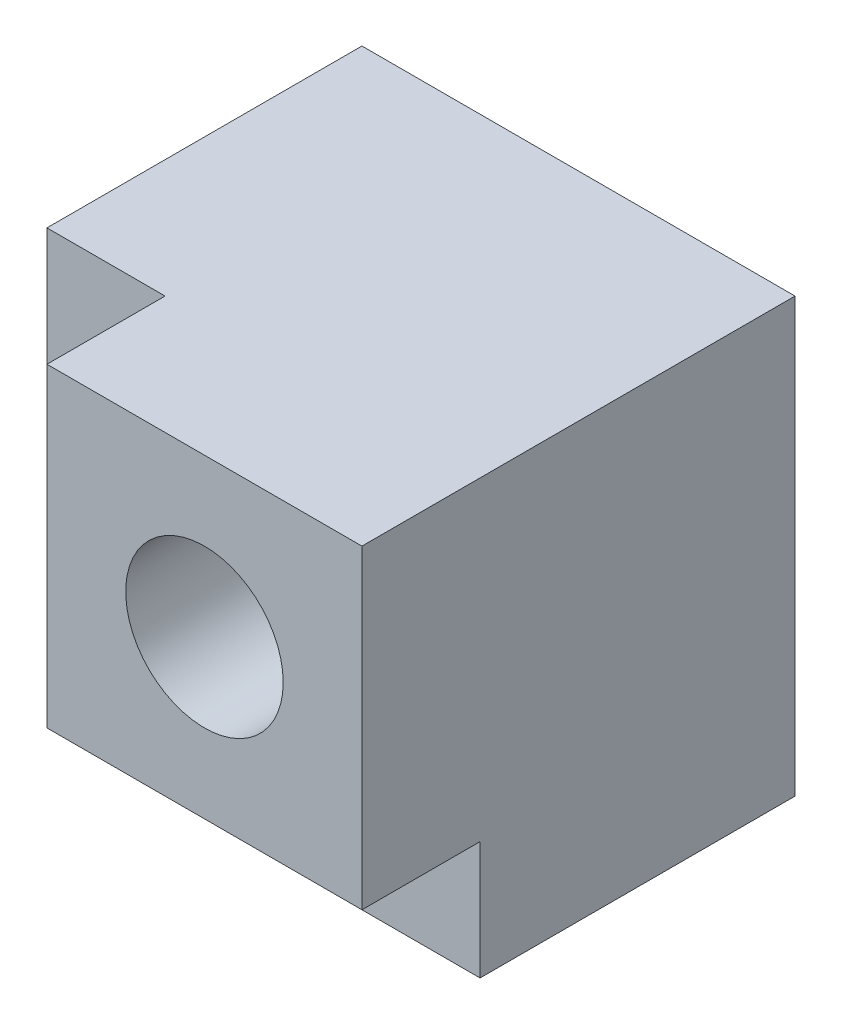
ISO-10303-21;
HEADER;
FILE_DESCRIPTION(('STEP AP214'),'2;1');
FILE_NAME('part.step','',(''),(''),'','','');
FILE_SCHEMA(('AUTOMOTIVE_DESIGN { 1 0 10303 214 1 1 1 1 }'));
ENDSEC;
DATA;
#1=APPLICATION_CONTEXT('core data for automotive mechanical design processes');
#2=APPLICATION_PROTOCOL_DEFINITION('international standard','automotive_design',2000,#1);
#3=PRODUCT_CONTEXT('',#1,'mechanical');
#4=PRODUCT('Part','Part','',(#3));
#5=PRODUCT_RELATED_PRODUCT_CATEGORY('part','',(#4));
#6=PRODUCT_DEFINITION_FORMATION('','',#4);
#7=PRODUCT_DEFINITION_CONTEXT('part definition',#1,'design');
#8=PRODUCT_DEFINITION('design','',#6,#7);
#9=PRODUCT_DEFINITION_SHAPE('','',#8);
#10=(LENGTH_UNIT() NAMED_UNIT(*) SI_UNIT(.MILLI.,.METRE.));
#11=(NAMED_UNIT(*) PLANE_ANGLE_UNIT() SI_UNIT($,.RADIAN.));
#12=(NAMED_UNIT(*) SI_UNIT($,.STERADIAN.) SOLID_ANGLE_UNIT());
#13=UNCERTAINTY_MEASURE_WITH_UNIT(LENGTH_MEASURE(1.E-05),#10,'distance_accuracy_value','');
#14=(GEOMETRIC_REPRESENTATION_CONTEXT(3) GLOBAL_UNCERTAINTY_ASSIGNED_CONTEXT((#13)) GLOBAL_UNIT_ASSIGNED_CONTEXT((#10,
#11,#12)) REPRESENTATION_CONTEXT('',''));
#15=CARTESIAN_POINT('',(0.,0.,0.));
#16=DIRECTION('',(0.,0.,1.));
#17=DIRECTION('',(1.,0.,0.));
#18=AXIS2_PLACEMENT_3D('',#15,#16,#17);
#19=CARTESIAN_POINT('',(0.,0.,0.));
#20=DIRECTION('',(0.,1.,0.));
#21=DIRECTION('',(0.,0.,1.));
#22=AXIS2_PLACEMENT_3D('',#19,#20,#21);
#23=PLANE('',#22);
#24=DIRECTION('',(0.,0.,-1.));
#25=VECTOR('',#24,1.);
#26=CARTESIAN_POINT('',(-40.,0.,40.));
#27=LINE('',#26,#25);
#28=CARTESIAN_POINT('',(-40.,0.,40.));
#29=VERTEX_POINT('',#28);
#30=CARTESIAN_POINT('',(-40.,0.,-40.));
#31=VERTEX_POINT('',#30);
#32=EDGE_CURVE('E120',#29,#31,#27,.T.);
#33=ORIENTED_EDGE('',*,*,#32,.F.);
#34=DIRECTION('',(1.,0.,0.));
#35=VECTOR('',#34,1.);
#36=CARTESIAN_POINT('',(-40.,0.,40.));
#37=LINE('',#36,#35);
#38=CARTESIAN_POINT('',(-70.,0.,40.));
#39=VERTEX_POINT('',#38);
#40=EDGE_CURVE('E163',#39,#29,#37,.T.);
#41=ORIENTED_EDGE('',*,*,#40,.F.);
#42=DIRECTION('',(0.,0.,1.));
#43=VECTOR('',#42,1.);
#44=CARTESIAN_POINT('',(-70.,0.,-40.));
#45=LINE('',#44,#43);
#46=CARTESIAN_POINT('',(-70.,0.,-40.));
#47=VERTEX_POINT('',#46);
#48=EDGE_CURVE('E149',#47,#39,#45,.T.);
#49=ORIENTED_EDGE('',*,*,#48,.F.);
#50=DIRECTION('',(-1.,0.,0.));
#51=VECTOR('',#50,1.);
#52=CARTESIAN_POINT('',(-40.,0.,-40.));
#53=LINE('',#52,#51);
#54=EDGE_CURVE('E47',#31,#47,#53,.T.);
#55=ORIENTED_EDGE('',*,*,#54,.F.);
#56=EDGE_LOOP('',(#33,#41,#49,#55));
#57=FACE_BOUND('',#56,.T.);
#58=ADVANCED_FACE('F32',(#57),#23,.F.);
#59=DIRECTION('',(-1.,0.,0.));
#60=VECTOR('',#59,1.);
#61=CARTESIAN_POINT('',(-40.,0.,40.));
#62=LINE('',#61,#60);
#63=CARTESIAN_POINT('',(40.,0.,40.));
#64=VERTEX_POINT('',#63);
#65=EDGE_CURVE('E55',#64,#29,#62,.T.);
#66=ORIENTED_EDGE('',*,*,#65,.F.);
#67=DIRECTION('',(0.,0.,-1.));
#68=VECTOR('',#67,1.);
#69=CARTESIAN_POINT('',(40.,0.,-40.));
#70=LINE('',#69,#68);
#71=CARTESIAN_POINT('',(40.,0.,70.));
#72=VERTEX_POINT('',#71);
#73=EDGE_CURVE('E158',#72,#64,#70,.T.);
#74=ORIENTED_EDGE('',*,*,#73,.F.);
#75=DIRECTION('',(1.,0.,0.));
#76=VECTOR('',#75,1.);
#77=CARTESIAN_POINT('',(40.,0.,70.));
#78=LINE('',#77,#76);
#79=CARTESIAN_POINT('',(-40.,0.,70.));
#80=VERTEX_POINT('',#79);
#81=EDGE_CURVE('E138',#80,#72,#78,.T.);
#82=ORIENTED_EDGE('',*,*,#81,.F.);
#83=DIRECTION('',(0.,0.,-1.));
#84=VECTOR('',#83,1.);
#85=CARTESIAN_POINT('',(-40.,0.,70.));
#86=LINE('',#85,#84);
#87=EDGE_CURVE('E140',#80,#29,#86,.T.);
#88=ORIENTED_EDGE('',*,*,#87,.T.);
#89=EDGE_LOOP('',(#66,#74,#82,#88));
#90=FACE_BOUND('',#89,.T.);
#91=ADVANCED_FACE('F220',(#90),#23,.F.);
#92=CARTESIAN_POINT('',(-40.,80.,40.));
#93=DIRECTION('',(0.,0.,-1.));
#94=DIRECTION('',(-1.,0.,0.));
#95=AXIS2_PLACEMENT_3D('',#92,#93,#94);
#96=PLANE('',#95);
#97=DIRECTION('',(0.,-1.,0.));
#98=VECTOR('',#97,1.);
#99=CARTESIAN_POINT('',(-40.,80.,40.));
#100=LINE('',#99,#98);
#101=CARTESIAN_POINT('',(-40.,80.,40.));
#102=VERTEX_POINT('',#101);
#103=EDGE_CURVE('E121',#102,#29,#100,.T.);
#104=ORIENTED_EDGE('',*,*,#103,.F.);
#105=DIRECTION('',(1.,0.,0.));
#106=VECTOR('',#105,1.);
#107=CARTESIAN_POINT('',(-40.,80.,40.));
#108=LINE('',#107,#106);
#109=CARTESIAN_POINT('',(-70.,80.,40.));
#110=VERTEX_POINT('',#109);
#111=EDGE_CURVE('E40',#110,#102,#108,.T.);
#112=ORIENTED_EDGE('',*,*,#111,.F.);
#113=DIRECTION('',(0.,1.,0.));
#114=VECTOR('',#113,1.);
#115=CARTESIAN_POINT('',(-70.,80.,40.));
#116=LINE('',#115,#114);
#117=EDGE_CURVE('E152',#39,#110,#116,.T.);
#118=ORIENTED_EDGE('',*,*,#117,.F.);
#119=ORIENTED_EDGE('',*,*,#40,.T.);
#120=EDGE_LOOP('',(#104,#112,#118,#119));
#121=FACE_BOUND('',#120,.T.);
#122=ADVANCED_FACE('F171',(#121),#96,.F.);
#123=CARTESIAN_POINT('',(40.,80.,-40.));
#124=DIRECTION('',(-1.,0.,0.));
#125=DIRECTION('',(0.,0.,1.));
#126=AXIS2_PLACEMENT_3D('',#123,#124,#125);
#127=PLANE('',#126);
#128=ORIENTED_EDGE('',*,*,#73,.T.);
#129=DIRECTION('',(0.,1.,0.));
#130=VECTOR('',#129,1.);
#131=CARTESIAN_POINT('',(40.,-30.,40.));
#132=LINE('',#131,#130);
#133=CARTESIAN_POINT('',(40.,-30.,40.));
#134=VERTEX_POINT('',#133);
#135=EDGE_CURVE('E122',#134,#64,#132,.T.);
#136=ORIENTED_EDGE('',*,*,#135,.F.);
#137=DIRECTION('',(0.,0.,1.));
#138=VECTOR('',#137,1.);
#139=CARTESIAN_POINT('',(40.,-30.,40.));
#140=LINE('',#139,#138);
#141=CARTESIAN_POINT('',(40.,-30.,-40.));
#142=VERTEX_POINT('',#141);
#143=EDGE_CURVE('E108',#142,#134,#140,.T.);
#144=ORIENTED_EDGE('',*,*,#143,.F.);
#145=DIRECTION('',(0.,-1.,0.));
#146=VECTOR('',#145,1.);
#147=CARTESIAN_POINT('',(40.,80.,-40.));
#148=LINE('',#147,#146);
#149=CARTESIAN_POINT('',(40.,80.,-40.));
#150=VERTEX_POINT('',#149);
#151=EDGE_CURVE('E11',#150,#142,#148,.T.);
#152=ORIENTED_EDGE('',*,*,#151,.F.);
#153=DIRECTION('',(0.,0.,-1.));
#154=VECTOR('',#153,1.);
#155=CARTESIAN_POINT('',(40.,80.,-40.));
#156=LINE('',#155,#154);
#157=CARTESIAN_POINT('',(40.,80.,70.));
#158=VERTEX_POINT('',#157);
#159=EDGE_CURVE('E159',#158,#150,#156,.T.);
#160=ORIENTED_EDGE('',*,*,#159,.F.);
#161=DIRECTION('',(0.,1.,0.));
#162=VECTOR('',#161,1.);
#163=CARTESIAN_POINT('',(40.,80.,70.));
#164=LINE('',#163,#162);
#165=EDGE_CURVE('E125',#72,#158,#164,.T.);
#166=ORIENTED_EDGE('',*,*,#165,.F.);
#167=EDGE_LOOP('',(#128,#136,#144,#152,#160,#166));
#168=FACE_BOUND('',#167,.T.);
#169=ADVANCED_FACE('F34',(#168),#127,.F.);
#170=CARTESIAN_POINT('',(-40.,80.,-40.));
#171=DIRECTION('',(0.,0.,1.));
#172=DIRECTION('',(1.,0.,0.));
#173=AXIS2_PLACEMENT_3D('',#170,#171,#172);
#174=PLANE('',#173);
#175=ORIENTED_EDGE('',*,*,#151,.T.);
#176=DIRECTION('',(1.,0.,0.));
#177=VECTOR('',#176,1.);
#178=CARTESIAN_POINT('',(-40.,-30.,-40.));
#179=LINE('',#178,#177);
#180=CARTESIAN_POINT('',(-40.,-30.,-40.));
#181=VERTEX_POINT('',#180);
#182=EDGE_CURVE('E99',#181,#142,#179,.T.);
#183=ORIENTED_EDGE('',*,*,#182,.F.);
#184=DIRECTION('',(0.,1.,0.));
#185=VECTOR('',#184,1.);
#186=CARTESIAN_POINT('',(-40.,-30.,-40.));
#187=LINE('',#186,#185);
#188=EDGE_CURVE('E103',#181,#31,#187,.T.);
#189=ORIENTED_EDGE('',*,*,#188,.T.);
#190=ORIENTED_EDGE('',*,*,#54,.T.);
#191=DIRECTION('',(0.,-1.,0.));
#192=VECTOR('',#191,1.);
#193=CARTESIAN_POINT('',(-70.,80.,-40.));
#194=LINE('',#193,#192);
#195=CARTESIAN_POINT('',(-70.,80.,-40.));
#196=VERTEX_POINT('',#195);
#197=EDGE_CURVE('E146',#196,#47,#194,.T.);
#198=ORIENTED_EDGE('',*,*,#197,.F.);
#199=DIRECTION('',(-1.,0.,0.));
#200=VECTOR('',#199,1.);
#201=CARTESIAN_POINT('',(-40.,80.,-40.));
#202=LINE('',#201,#200);
#203=EDGE_CURVE('E162',#150,#196,#202,.T.);
#204=ORIENTED_EDGE('',*,*,#203,.F.);
#205=EDGE_LOOP('',(#175,#183,#189,#190,#198,#204));
#206=FACE_BOUND('',#205,.T.);
#207=ADVANCED_FACE('F101',(#206),#174,.F.);
#208=CARTESIAN_POINT('',(0.,80.,0.));
#209=DIRECTION('',(0.,1.,0.));
#210=DIRECTION('',(0.,0.,1.));
#211=AXIS2_PLACEMENT_3D('',#208,#209,#210);
#212=PLANE('',#211);
#213=ORIENTED_EDGE('',*,*,#159,.T.);
#214=ORIENTED_EDGE('',*,*,#203,.T.);
#215=DIRECTION('',(0.,0.,-1.));
#216=VECTOR('',#215,1.);
#217=CARTESIAN_POINT('',(-70.,80.,-40.));
#218=LINE('',#217,#216);
#219=EDGE_CURVE('E155',#110,#196,#218,.T.);
#220=ORIENTED_EDGE('',*,*,#219,.F.);
#221=ORIENTED_EDGE('',*,*,#111,.T.);
#222=DIRECTION('',(0.,0.,-1.));
#223=VECTOR('',#222,1.);
#224=CARTESIAN_POINT('',(-40.,80.,70.));
#225=LINE('',#224,#223);
#226=CARTESIAN_POINT('',(-40.,80.,70.));
#227=VERTEX_POINT('',#226);
#228=EDGE_CURVE('E143',#227,#102,#225,.T.);
#229=ORIENTED_EDGE('',*,*,#228,.F.);
#230=DIRECTION('',(-1.,0.,0.));
#231=VECTOR('',#230,1.);
#232=CARTESIAN_POINT('',(40.,80.,70.));
#233=LINE('',#232,#231);
#234=EDGE_CURVE('E134',#158,#227,#233,.T.);
#235=ORIENTED_EDGE('',*,*,#234,.F.);
#236=EDGE_LOOP('',(#213,#214,#220,#221,#229,#235));
#237=FACE_BOUND('',#236,.T.);
#238=ADVANCED_FACE('F227',(#237),#212,.T.);
#239=CARTESIAN_POINT('',(-70.,0.,0.));
#240=DIRECTION('',(-1.,0.,0.));
#241=DIRECTION('',(0.,0.,1.));
#242=AXIS2_PLACEMENT_3D('',#239,#240,#241);
#243=PLANE('',#242);
#244=CARTESIAN_POINT('',(-70.,40.,0.));
#245=DIRECTION('',(-1.,0.,0.));
#246=DIRECTION('',(0.,0.,1.));
#247=AXIS2_PLACEMENT_3D('',#244,#245,#246);
#248=CIRCLE('',#247,20.);
#249=CARTESIAN_POINT('',(-70.,40.,20.));
#250=VERTEX_POINT('',#249);
#251=EDGE_CURVE('E181',#250,#250,#248,.T.);
#252=ORIENTED_EDGE('',*,*,#251,.F.);
#253=EDGE_LOOP('',(#252));
#254=FACE_BOUND('',#253,.T.);
#255=ORIENTED_EDGE('',*,*,#197,.T.);
#256=ORIENTED_EDGE('',*,*,#48,.T.);
#257=ORIENTED_EDGE('',*,*,#117,.T.);
#258=ORIENTED_EDGE('',*,*,#219,.T.);
#259=EDGE_LOOP('',(#255,#256,#257,#258));
#260=FACE_BOUND('',#259,.T.);
#261=ADVANCED_FACE('F235',(#254,#260),#243,.T.);
#262=CARTESIAN_POINT('',(-40.,80.,70.));
#263=DIRECTION('',(1.,0.,0.));
#264=DIRECTION('',(0.,0.,-1.));
#265=AXIS2_PLACEMENT_3D('',#262,#263,#264);
#266=PLANE('',#265);
#267=ORIENTED_EDGE('',*,*,#103,.T.);
#268=ORIENTED_EDGE('',*,*,#87,.F.);
#269=DIRECTION('',(0.,-1.,0.));
#270=VECTOR('',#269,1.);
#271=CARTESIAN_POINT('',(-40.,80.,70.));
#272=LINE('',#271,#270);
#273=EDGE_CURVE('E136',#227,#80,#272,.T.);
#274=ORIENTED_EDGE('',*,*,#273,.F.);
#275=ORIENTED_EDGE('',*,*,#228,.T.);
#276=EDGE_LOOP('',(#267,#268,#274,#275));
#277=FACE_BOUND('',#276,.T.);
#278=ADVANCED_FACE('F249',(#277),#266,.F.);
#279=CARTESIAN_POINT('',(0.,0.,70.));
#280=DIRECTION('',(0.,0.,-1.));
#281=DIRECTION('',(-1.,0.,0.));
#282=AXIS2_PLACEMENT_3D('',#279,#280,#281);
#283=PLANE('',#282);
#284=CARTESIAN_POINT('',(0.,40.,70.));
#285=DIRECTION('',(0.,0.,1.));
#286=DIRECTION('',(1.,0.,0.));
#287=AXIS2_PLACEMENT_3D('',#284,#285,#286);
#288=CIRCLE('',#287,20.);
#289=CARTESIAN_POINT('',(20.,40.,70.));
#290=VERTEX_POINT('',#289);
#291=EDGE_CURVE('E187',#290,#290,#288,.T.);
#292=ORIENTED_EDGE('',*,*,#291,.F.);
#293=EDGE_LOOP('',(#292));
#294=FACE_BOUND('',#293,.T.);
#295=ORIENTED_EDGE('',*,*,#165,.T.);
#296=ORIENTED_EDGE('',*,*,#234,.T.);
#297=ORIENTED_EDGE('',*,*,#273,.T.);
#298=ORIENTED_EDGE('',*,*,#81,.T.);
#299=EDGE_LOOP('',(#295,#296,#297,#298));
#300=FACE_BOUND('',#299,.T.);
#301=ADVANCED_FACE('F243',(#294,#300),#283,.F.);
#302=CARTESIAN_POINT('',(-40.,-30.,40.));
#303=DIRECTION('',(1.,0.,0.));
#304=DIRECTION('',(0.,0.,-1.));
#305=AXIS2_PLACEMENT_3D('',#302,#303,#304);
#306=PLANE('',#305);
#307=ORIENTED_EDGE('',*,*,#32,.T.);
#308=ORIENTED_EDGE('',*,*,#188,.F.);
#309=DIRECTION('',(0.,0.,-1.));
#310=VECTOR('',#309,1.);
#311=CARTESIAN_POINT('',(-40.,-30.,40.));
#312=LINE('',#311,#310);
#313=CARTESIAN_POINT('',(-40.,-30.,40.));
#314=VERTEX_POINT('',#313);
#315=EDGE_CURVE('E109',#314,#181,#312,.T.);
#316=ORIENTED_EDGE('',*,*,#315,.F.);
#317=DIRECTION('',(0.,1.,0.));
#318=VECTOR('',#317,1.);
#319=CARTESIAN_POINT('',(-40.,-30.,40.));
#320=LINE('',#319,#318);
#321=EDGE_CURVE('E128',#314,#29,#320,.T.);
#322=ORIENTED_EDGE('',*,*,#321,.T.);
#323=EDGE_LOOP('',(#307,#308,#316,#322));
#324=FACE_BOUND('',#323,.T.);
#325=ADVANCED_FACE('F119',(#324),#306,.F.);
#326=CARTESIAN_POINT('',(-40.,-30.,40.));
#327=DIRECTION('',(0.,0.,-1.));
#328=DIRECTION('',(-1.,0.,0.));
#329=AXIS2_PLACEMENT_3D('',#326,#327,#328);
#330=PLANE('',#329);
#331=ORIENTED_EDGE('',*,*,#65,.T.);
#332=ORIENTED_EDGE('',*,*,#321,.F.);
#333=DIRECTION('',(-1.,0.,0.));
#334=VECTOR('',#333,1.);
#335=CARTESIAN_POINT('',(-40.,-30.,40.));
#336=LINE('',#335,#334);
#337=EDGE_CURVE('E114',#134,#314,#336,.T.);
#338=ORIENTED_EDGE('',*,*,#337,.F.);
#339=ORIENTED_EDGE('',*,*,#135,.T.);
#340=EDGE_LOOP('',(#331,#332,#338,#339));
#341=FACE_BOUND('',#340,.T.);
#342=ADVANCED_FACE('F175',(#341),#330,.F.);
#343=CARTESIAN_POINT('',(0.,-30.,0.));
#344=DIRECTION('',(0.,-1.,0.));
#345=DIRECTION('',(0.,0.,-1.));
#346=AXIS2_PLACEMENT_3D('',#343,#344,#345);
#347=PLANE('',#346);
#348=CARTESIAN_POINT('',(0.,-30.,0.));
#349=DIRECTION('',(0.,-1.,0.));
#350=DIRECTION('',(0.,0.,-1.));
#351=AXIS2_PLACEMENT_3D('',#348,#349,#350);
#352=CIRCLE('',#351,20.);
#353=CARTESIAN_POINT('',(0.,-30.,-20.));
#354=VERTEX_POINT('',#353);
#355=EDGE_CURVE('E193',#354,#354,#352,.T.);
#356=ORIENTED_EDGE('',*,*,#355,.F.);
#357=EDGE_LOOP('',(#356));
#358=FACE_BOUND('',#357,.T.);
#359=ORIENTED_EDGE('',*,*,#315,.T.);
#360=ORIENTED_EDGE('',*,*,#182,.T.);
#361=ORIENTED_EDGE('',*,*,#143,.T.);
#362=ORIENTED_EDGE('',*,*,#337,.T.);
#363=EDGE_LOOP('',(#359,#360,#361,#362));
#364=FACE_BOUND('',#363,.T.);
#365=ADVANCED_FACE('F112',(#358,#364),#347,.T.);
#366=CARTESIAN_POINT('',(-25.,40.,0.));
#367=DIRECTION('',(-1.,0.,0.));
#368=DIRECTION('',(0.,0.,1.));
#369=AXIS2_PLACEMENT_3D('',#366,#367,#368);
#370=CYLINDRICAL_SURFACE('',#369,20.);
#371=CARTESIAN_POINT('',(-25.,40.,0.));
#372=DIRECTION('',(-1.,0.,0.));
#373=DIRECTION('',(0.,0.,1.));
#374=AXIS2_PLACEMENT_3D('',#371,#372,#373);
#375=CIRCLE('',#374,20.);
#376=CARTESIAN_POINT('',(-25.,40.,20.));
#377=VERTEX_POINT('',#376);
#378=EDGE_CURVE('E172',#377,#377,#375,.T.);
#379=CARTESIAN_POINT('',(-25.,40.,20.));
#380=CARTESIAN_POINT('',(-25.46875,40.,20.));
#381=CARTESIAN_POINT('',(-25.9375,40.,20.));
#382=CARTESIAN_POINT('',(-26.875,40.,20.));
#383=CARTESIAN_POINT('',(-27.34375,40.,20.));
#384=CARTESIAN_POINT('',(-28.28125,40.,20.));
#385=CARTESIAN_POINT('',(-28.75,40.,20.));
#386=CARTESIAN_POINT('',(-29.6875,40.,20.));
#387=CARTESIAN_POINT('',(-30.15625,40.,20.));
#388=CARTESIAN_POINT('',(-31.09375,40.,20.));
#389=CARTESIAN_POINT('',(-31.5625,40.,20.));
#390=CARTESIAN_POINT('',(-32.5,40.,20.));
#391=CARTESIAN_POINT('',(-32.96875,40.,20.));
#392=CARTESIAN_POINT('',(-33.90625,40.,20.));
#393=CARTESIAN_POINT('',(-34.375,40.,20.));
#394=CARTESIAN_POINT('',(-35.3125,40.,20.));
#395=CARTESIAN_POINT('',(-35.78125,40.,20.));
#396=CARTESIAN_POINT('',(-36.71875,40.,20.));
#397=CARTESIAN_POINT('',(-37.1875,40.,20.));
#398=CARTESIAN_POINT('',(-38.125,40.,20.));
#399=CARTESIAN_POINT('',(-38.59375,40.,20.));
#400=CARTESIAN_POINT('',(-39.53125,40.,20.));
#401=CARTESIAN_POINT('',(-40.,40.,20.));
#402=CARTESIAN_POINT('',(-40.9375,40.,20.));
#403=CARTESIAN_POINT('',(-41.40625,40.,20.));
#404=CARTESIAN_POINT('',(-42.34375,40.,20.));
#405=CARTESIAN_POINT('',(-42.8125,40.,20.));
#406=CARTESIAN_POINT('',(-43.75,40.,20.));
#407=CARTESIAN_POINT('',(-44.21875,40.,20.));
#408=CARTESIAN_POINT('',(-45.15625,40.,20.));
#409=CARTESIAN_POINT('',(-45.625,40.,20.));
#410=CARTESIAN_POINT('',(-46.5625,40.,20.));
#411=CARTESIAN_POINT('',(-47.03125,40.,20.));
#412=CARTESIAN_POINT('',(-47.96875,40.,20.));
#413=CARTESIAN_POINT('',(-48.4375,40.,20.));
#414=CARTESIAN_POINT('',(-49.375,40.,20.));
#415=CARTESIAN_POINT('',(-49.84375,40.,20.));
#416=CARTESIAN_POINT('',(-50.78125,40.,20.));
#417=CARTESIAN_POINT('',(-51.25,40.,20.));
#418=CARTESIAN_POINT('',(-52.1875,40.,20.));
#419=CARTESIAN_POINT('',(-52.65625,40.,20.));
#420=CARTESIAN_POINT('',(-53.59375,40.,20.));
#421=CARTESIAN_POINT('',(-54.0625,40.,20.));
#422=CARTESIAN_POINT('',(-55.,40.,20.));
#423=CARTESIAN_POINT('',(-55.46875,40.,20.));
#424=CARTESIAN_POINT('',(-56.40625,40.,20.));
#425=CARTESIAN_POINT('',(-56.875,40.,20.));
#426=CARTESIAN_POINT('',(-57.8125,40.,20.));
#427=CARTESIAN_POINT('',(-58.28125,40.,20.));
#428=CARTESIAN_POINT('',(-59.21875,40.,20.));
#429=CARTESIAN_POINT('',(-59.6875,40.,20.));
#430=CARTESIAN_POINT('',(-60.625,40.,20.));
#431=CARTESIAN_POINT('',(-61.09375,40.,20.));
#432=CARTESIAN_POINT('',(-62.03125,40.,20.));
#433=CARTESIAN_POINT('',(-62.5,40.,20.));
#434=CARTESIAN_POINT('',(-63.4375,40.,20.));
#435=CARTESIAN_POINT('',(-63.90625,40.,20.));
#436=CARTESIAN_POINT('',(-64.84375,40.,20.));
#437=CARTESIAN_POINT('',(-65.3125,40.,20.));
#438=CARTESIAN_POINT('',(-66.25,40.,20.));
#439=CARTESIAN_POINT('',(-66.71875,40.,20.));
#440=CARTESIAN_POINT('',(-67.65625,40.,20.));
#441=CARTESIAN_POINT('',(-68.125,40.,20.));
#442=CARTESIAN_POINT('',(-69.0625,40.,20.));
#443=CARTESIAN_POINT('',(-69.53125,40.,20.));
#444=CARTESIAN_POINT('',(-70.,40.,20.));
#445=B_SPLINE_CURVE_WITH_KNOTS('',3,(#379,#380,#381,#382,#383,#384,#385,#386,#387,#388,#389,
#390,#391,#392,#393,#394,#395,#396,#397,#398,#399,#400,#401,#402,#403,#404,#405,#406,#407,#408,
#409,#410,#411,#412,#413,#414,#415,#416,#417,#418,#419,#420,#421,#422,#423,#424,#425,#426,#427,
#428,#429,#430,#431,#432,#433,#434,#435,#436,#437,#438,#439,#440,#441,#442,#443,#444),
.UNSPECIFIED.,.F.,.F.,(4,2,2,2,2,2,2,2,2,2,2,2,2,2,2,2,2,2,2,2,2,2,2,2,2,2,2,2,2,2,2,2,4),(0.,
1.40625,2.8125,4.21875,5.625,7.03125,8.4375,9.84375,11.25,12.65625,14.0625,15.46875,16.875,
18.28125,19.6875,21.09375,22.5,23.90625,25.3125,26.71875,28.125,29.53125,30.9375,32.34375,33.75,
35.15625,36.5625,37.96875,39.375,40.78125,42.1875,43.59375,45.),.UNSPECIFIED.);
#446=EDGE_CURVE('BSEAM209',#377,#250,#445,.T.);
#447=ORIENTED_EDGE('',*,*,#378,.F.);
#448=ORIENTED_EDGE('',*,*,#251,.T.);
#449=ORIENTED_EDGE('',*,*,#446,.T.);
#450=ORIENTED_EDGE('',*,*,#446,.F.);
#451=EDGE_LOOP('',(#447,#449,#448,#450));
#452=FACE_BOUND('',#451,.T.);
#453=ADVANCED_FACE('F209',(#452),#370,.F.);
#454=CARTESIAN_POINT('',(-25.,40.,0.));
#455=DIRECTION('',(-1.,0.,0.));
#456=DIRECTION('',(0.,0.,1.));
#457=AXIS2_PLACEMENT_3D('',#454,#455,#456);
#458=PLANE('',#457);
#459=ORIENTED_EDGE('',*,*,#378,.T.);
#460=EDGE_LOOP('',(#459));
#461=FACE_BOUND('',#460,.T.);
#462=ADVANCED_FACE('F215',(#461),#458,.T.);
#463=CARTESIAN_POINT('',(0.,40.,25.));
#464=DIRECTION('',(0.,0.,1.));
#465=DIRECTION('',(1.,0.,0.));
#466=AXIS2_PLACEMENT_3D('',#463,#464,#465);
#467=CYLINDRICAL_SURFACE('',#466,20.);
#468=CARTESIAN_POINT('',(0.,40.,25.));
#469=DIRECTION('',(0.,0.,1.));
#470=DIRECTION('',(1.,0.,0.));
#471=AXIS2_PLACEMENT_3D('',#468,#469,#470);
#472=CIRCLE('',#471,20.);
#473=CARTESIAN_POINT('',(20.,40.,25.));
#474=VERTEX_POINT('',#473);
#475=EDGE_CURVE('E184',#474,#474,#472,.T.);
#476=CARTESIAN_POINT('',(20.,40.,25.));
#477=CARTESIAN_POINT('',(20.,40.,25.46875));
#478=CARTESIAN_POINT('',(20.,40.,25.9375));
#479=CARTESIAN_POINT('',(20.,40.,26.875));
#480=CARTESIAN_POINT('',(20.,40.,27.34375));
#481=CARTESIAN_POINT('',(20.,40.,28.28125));
#482=CARTESIAN_POINT('',(20.,40.,28.75));
#483=CARTESIAN_POINT('',(20.,40.,29.6875));
#484=CARTESIAN_POINT('',(20.,40.,30.15625));
#485=CARTESIAN_POINT('',(20.,40.,31.09375));
#486=CARTESIAN_POINT('',(20.,40.,31.5625));
#487=CARTESIAN_POINT('',(20.,40.,32.5));
#488=CARTESIAN_POINT('',(20.,40.,32.96875));
#489=CARTESIAN_POINT('',(20.,40.,33.90625));
#490=CARTESIAN_POINT('',(20.,40.,34.375));
#491=CARTESIAN_POINT('',(20.,40.,35.3125));
#492=CARTESIAN_POINT('',(20.,40.,35.78125));
#493=CARTESIAN_POINT('',(20.,40.,36.71875));
#494=CARTESIAN_POINT('',(20.,40.,37.1875));
#495=CARTESIAN_POINT('',(20.,40.,38.125));
#496=CARTESIAN_POINT('',(20.,40.,38.59375));
#497=CARTESIAN_POINT('',(20.,40.,39.53125));
#498=CARTESIAN_POINT('',(20.,40.,40.));
#499=CARTESIAN_POINT('',(20.,40.,40.9375));
#500=CARTESIAN_POINT('',(20.,40.,41.40625));
#501=CARTESIAN_POINT('',(20.,40.,42.34375));
#502=CARTESIAN_POINT('',(20.,40.,42.8125));
#503=CARTESIAN_POINT('',(20.,40.,43.75));
#504=CARTESIAN_POINT('',(20.,40.,44.21875));
#505=CARTESIAN_POINT('',(20.,40.,45.15625));
#506=CARTESIAN_POINT('',(20.,40.,45.625));
#507=CARTESIAN_POINT('',(20.,40.,46.5625));
#508=CARTESIAN_POINT('',(20.,40.,47.03125));
#509=CARTESIAN_POINT('',(20.,40.,47.96875));
#510=CARTESIAN_POINT('',(20.,40.,48.4375));
#511=CARTESIAN_POINT('',(20.,40.,49.375));
#512=CARTESIAN_POINT('',(20.,40.,49.84375));
#513=CARTESIAN_POINT('',(20.,40.,50.78125));
#514=CARTESIAN_POINT('',(20.,40.,51.25));
#515=CARTESIAN_POINT('',(20.,40.,52.1875));
#516=CARTESIAN_POINT('',(20.,40.,52.65625));
#517=CARTESIAN_POINT('',(20.,40.,53.59375));
#518=CARTESIAN_POINT('',(20.,40.,54.0625));
#519=CARTESIAN_POINT('',(20.,40.,55.));
#520=CARTESIAN_POINT('',(20.,40.,55.46875));
#521=CARTESIAN_POINT('',(20.,40.,56.40625));
#522=CARTESIAN_POINT('',(20.,40.,56.875));
#523=CARTESIAN_POINT('',(20.,40.,57.8125));
#524=CARTESIAN_POINT('',(20.,40.,58.28125));
#525=CARTESIAN_POINT('',(20.,40.,59.21875));
#526=CARTESIAN_POINT('',(20.,40.,59.6875));
#527=CARTESIAN_POINT('',(20.,40.,60.625));
#528=CARTESIAN_POINT('',(20.,40.,61.09375));
#529=CARTESIAN_POINT('',(20.,40.,62.03125));
#530=CARTESIAN_POINT('',(20.,40.,62.5));
#531=CARTESIAN_POINT('',(20.,40.,63.4375));
#532=CARTESIAN_POINT('',(20.,40.,63.90625));
#533=CARTESIAN_POINT('',(20.,40.,64.84375));
#534=CARTESIAN_POINT('',(20.,40.,65.3125));
#535=CARTESIAN_POINT('',(20.,40.,66.25));
#536=CARTESIAN_POINT('',(20.,40.,66.71875));
#537=CARTESIAN_POINT('',(20.,40.,67.65625));
#538=CARTESIAN_POINT('',(20.,40.,68.125));
#539=CARTESIAN_POINT('',(20.,40.,69.0625));
#540=CARTESIAN_POINT('',(20.,40.,69.53125));
#541=CARTESIAN_POINT('',(20.,40.,70.));
#542=B_SPLINE_CURVE_WITH_KNOTS('',3,(#476,#477,#478,#479,#480,#481,#482,#483,#484,#485,#486,
#487,#488,#489,#490,#491,#492,#493,#494,#495,#496,#497,#498,#499,#500,#501,#502,#503,#504,#505,
#506,#507,#508,#509,#510,#511,#512,#513,#514,#515,#516,#517,#518,#519,#520,#521,#522,#523,#524,
#525,#526,#527,#528,#529,#530,#531,#532,#533,#534,#535,#536,#537,#538,#539,#540,#541),
.UNSPECIFIED.,.F.,.F.,(4,2,2,2,2,2,2,2,2,2,2,2,2,2,2,2,2,2,2,2,2,2,2,2,2,2,2,2,2,2,2,2,4),(0.,
1.40625,2.8125,4.21875,5.625,7.03125,8.4375,9.84375,11.25,12.65625,14.0625,15.46875,16.875,
18.28125,19.6875,21.09375,22.5,23.90625,25.3125,26.71875,28.125,29.53125,30.9375,32.34375,33.75,
35.15625,36.5625,37.96875,39.375,40.78125,42.1875,43.59375,45.),.UNSPECIFIED.);
#543=EDGE_CURVE('BSEAM294',#474,#290,#542,.T.);
#544=ORIENTED_EDGE('',*,*,#475,.F.);
#545=ORIENTED_EDGE('',*,*,#291,.T.);
#546=ORIENTED_EDGE('',*,*,#543,.T.);
#547=ORIENTED_EDGE('',*,*,#543,.F.);
#548=EDGE_LOOP('',(#544,#546,#545,#547));
#549=FACE_BOUND('',#548,.T.);
#550=ADVANCED_FACE('F294',(#549),#467,.F.);
#551=CARTESIAN_POINT('',(0.,40.,25.));
#552=DIRECTION('',(0.,0.,1.));
#553=DIRECTION('',(1.,0.,0.));
#554=AXIS2_PLACEMENT_3D('',#551,#552,#553);
#555=PLANE('',#554);
#556=ORIENTED_EDGE('',*,*,#475,.T.);
#557=EDGE_LOOP('',(#556));
#558=FACE_BOUND('',#557,.T.);
#559=ADVANCED_FACE('F204',(#558),#555,.T.);
#560=CARTESIAN_POINT('',(0.,15.,0.));
#561=DIRECTION('',(0.,-1.,0.));
#562=DIRECTION('',(0.,0.,-1.));
#563=AXIS2_PLACEMENT_3D('',#560,#561,#562);
#564=CYLINDRICAL_SURFACE('',#563,20.);
#565=CARTESIAN_POINT('',(0.,15.,0.));
#566=DIRECTION('',(0.,-1.,0.));
#567=DIRECTION('',(0.,0.,-1.));
#568=AXIS2_PLACEMENT_3D('',#565,#566,#567);
#569=CIRCLE('',#568,20.);
#570=CARTESIAN_POINT('',(0.,15.,-20.));
#571=VERTEX_POINT('',#570);
#572=EDGE_CURVE('E190',#571,#571,#569,.T.);
#573=CARTESIAN_POINT('',(0.,15.,-20.));
#574=CARTESIAN_POINT('',(0.,14.53125,-20.));
#575=CARTESIAN_POINT('',(0.,14.0625,-20.));
#576=CARTESIAN_POINT('',(0.,13.125,-20.));
#577=CARTESIAN_POINT('',(0.,12.65625,-20.));
#578=CARTESIAN_POINT('',(0.,11.71875,-20.));
#579=CARTESIAN_POINT('',(0.,11.25,-20.));
#580=CARTESIAN_POINT('',(0.,10.3125,-20.));
#581=CARTESIAN_POINT('',(0.,9.84375,-20.));
#582=CARTESIAN_POINT('',(0.,8.90625,-20.));
#583=CARTESIAN_POINT('',(0.,8.4375,-20.));
#584=CARTESIAN_POINT('',(0.,7.5,-20.));
#585=CARTESIAN_POINT('',(0.,7.03125,-20.));
#586=CARTESIAN_POINT('',(0.,6.09375,-20.));
#587=CARTESIAN_POINT('',(0.,5.625,-20.));
#588=CARTESIAN_POINT('',(0.,4.6875,-20.));
#589=CARTESIAN_POINT('',(0.,4.21875,-20.));
#590=CARTESIAN_POINT('',(0.,3.28125,-20.));
#591=CARTESIAN_POINT('',(0.,2.8125,-20.));
#592=CARTESIAN_POINT('',(0.,1.875,-20.));
#593=CARTESIAN_POINT('',(0.,1.40625,-20.));
#594=CARTESIAN_POINT('',(0.,0.468750000000004,-20.));
#595=CARTESIAN_POINT('',(0.,0.,-20.));
#596=CARTESIAN_POINT('',(0.,-0.937499999999997,-20.));
#597=CARTESIAN_POINT('',(0.,-1.40625,-20.));
#598=CARTESIAN_POINT('',(0.,-2.34375,-20.));
#599=CARTESIAN_POINT('',(0.,-2.8125,-20.));
#600=CARTESIAN_POINT('',(0.,-3.75,-20.));
#601=CARTESIAN_POINT('',(0.,-4.21875,-20.));
#602=CARTESIAN_POINT('',(0.,-5.15625,-20.));
#603=CARTESIAN_POINT('',(0.,-5.625,-20.));
#604=CARTESIAN_POINT('',(0.,-6.5625,-20.));
#605=CARTESIAN_POINT('',(0.,-7.03125,-20.));
#606=CARTESIAN_POINT('',(0.,-7.96875,-20.));
#607=CARTESIAN_POINT('',(0.,-8.4375,-20.));
#608=CARTESIAN_POINT('',(0.,-9.375,-20.));
#609=CARTESIAN_POINT('',(0.,-9.84375,-20.));
#610=CARTESIAN_POINT('',(0.,-10.78125,-20.));
#611=CARTESIAN_POINT('',(0.,-11.25,-20.));
#612=CARTESIAN_POINT('',(0.,-12.1875,-20.));
#613=CARTESIAN_POINT('',(0.,-12.65625,-20.));
#614=CARTESIAN_POINT('',(0.,-13.59375,-20.));
#615=CARTESIAN_POINT('',(0.,-14.0625,-20.));
#616=CARTESIAN_POINT('',(0.,-15.,-20.));
#617=CARTESIAN_POINT('',(0.,-15.46875,-20.));
#618=CARTESIAN_POINT('',(0.,-16.40625,-20.));
#619=CARTESIAN_POINT('',(0.,-16.875,-20.));
#620=CARTESIAN_POINT('',(0.,-17.8125,-20.));
#621=CARTESIAN_POINT('',(0.,-18.28125,-20.));
#622=CARTESIAN_POINT('',(0.,-19.21875,-20.));
#623=CARTESIAN_POINT('',(0.,-19.6875,-20.));
#624=CARTESIAN_POINT('',(0.,-20.625,-20.));
#625=CARTESIAN_POINT('',(0.,-21.09375,-20.));
#626=CARTESIAN_POINT('',(0.,-22.03125,-20.));
#627=CARTESIAN_POINT('',(0.,-22.5,-20.));
#628=CARTESIAN_POINT('',(0.,-23.4375,-20.));
#629=CARTESIAN_POINT('',(0.,-23.90625,-20.));
#630=CARTESIAN_POINT('',(0.,-24.84375,-20.));
#631=CARTESIAN_POINT('',(0.,-25.3125,-20.));
#632=CARTESIAN_POINT('',(0.,-26.25,-20.));
#633=CARTESIAN_POINT('',(0.,-26.71875,-20.));
#634=CARTESIAN_POINT('',(0.,-27.65625,-20.));
#635=CARTESIAN_POINT('',(0.,-28.125,-20.));
#636=CARTESIAN_POINT('',(0.,-29.0625,-20.));
#637=CARTESIAN_POINT('',(0.,-29.53125,-20.));
#638=CARTESIAN_POINT('',(0.,-30.,-20.));
#639=B_SPLINE_CURVE_WITH_KNOTS('',3,(#573,#574,#575,#576,#577,#578,#579,#580,#581,#582,#583,
#584,#585,#586,#587,#588,#589,#590,#591,#592,#593,#594,#595,#596,#597,#598,#599,#600,#601,#602,
#603,#604,#605,#606,#607,#608,#609,#610,#611,#612,#613,#614,#615,#616,#617,#618,#619,#620,#621,
#622,#623,#624,#625,#626,#627,#628,#629,#630,#631,#632,#633,#634,#635,#636,#637,#638),
.UNSPECIFIED.,.F.,.F.,(4,2,2,2,2,2,2,2,2,2,2,2,2,2,2,2,2,2,2,2,2,2,2,2,2,2,2,2,2,2,2,2,4),(0.,
1.40625,2.8125,4.21875,5.625,7.03125,8.4375,9.84375,11.25,12.65625,14.0625,15.46875,16.875,
18.28125,19.6875,21.09375,22.5,23.90625,25.3125,26.71875,28.125,29.53125,30.9375,32.34375,33.75,
35.15625,36.5625,37.96875,39.375,40.78125,42.1875,43.59375,45.),.UNSPECIFIED.);
#640=EDGE_CURVE('BSEAM201',#571,#354,#639,.T.);
#641=ORIENTED_EDGE('',*,*,#572,.F.);
#642=ORIENTED_EDGE('',*,*,#355,.T.);
#643=ORIENTED_EDGE('',*,*,#640,.T.);
#644=ORIENTED_EDGE('',*,*,#640,.F.);
#645=EDGE_LOOP('',(#641,#643,#642,#644));
#646=FACE_BOUND('',#645,.T.);
#647=ADVANCED_FACE('F201',(#646),#564,.F.);
#648=CARTESIAN_POINT('',(0.,15.,0.));
#649=DIRECTION('',(0.,-1.,0.));
#650=DIRECTION('',(0.,0.,-1.));
#651=AXIS2_PLACEMENT_3D('',#648,#649,#650);
#652=PLANE('',#651);
#653=ORIENTED_EDGE('',*,*,#572,.T.);
#654=EDGE_LOOP('',(#653));
#655=FACE_BOUND('',#654,.T.);
#656=ADVANCED_FACE('F199',(#655),#652,.T.);
#657=CLOSED_SHELL('',(#58,#91,#122,#169,#207,#238,#261,#278,#301,#325,#342,#365,#453,#462,#550,
#559,#647,#656));
#658=MANIFOLD_SOLID_BREP('B2',#657);
#659=ADVANCED_BREP_SHAPE_REPRESENTATION('',(#18,#658),#14);
#660=SHAPE_DEFINITION_REPRESENTATION(#9,#659);
ENDSEC;
END-ISO-10303-21;
